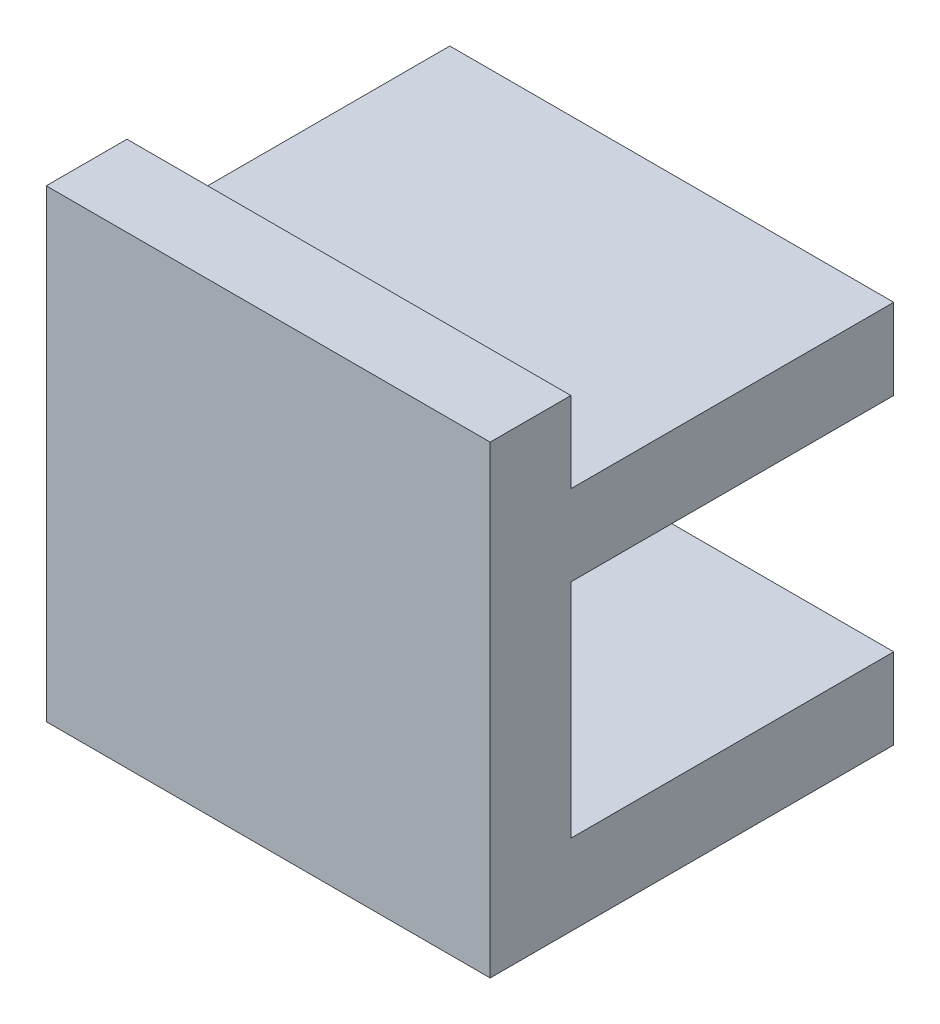
ISO-10303-21;
HEADER;
FILE_DESCRIPTION(('STEP AP214'),'2;1');
FILE_NAME('part.step','',(''),(''),'','','');
FILE_SCHEMA(('AUTOMOTIVE_DESIGN { 1 0 10303 214 1 1 1 1 }'));
ENDSEC;
DATA;
#1=APPLICATION_CONTEXT('core data for automotive mechanical design processes');
#2=APPLICATION_PROTOCOL_DEFINITION('international standard','automotive_design',2000,#1);
#3=PRODUCT_CONTEXT('',#1,'mechanical');
#4=PRODUCT('Part','Part','',(#3));
#5=PRODUCT_RELATED_PRODUCT_CATEGORY('part','',(#4));
#6=PRODUCT_DEFINITION_FORMATION('','',#4);
#7=PRODUCT_DEFINITION_CONTEXT('part definition',#1,'design');
#8=PRODUCT_DEFINITION('design','',#6,#7);
#9=PRODUCT_DEFINITION_SHAPE('','',#8);
#10=(LENGTH_UNIT() NAMED_UNIT(*) SI_UNIT(.MILLI.,.METRE.));
#11=(NAMED_UNIT(*) PLANE_ANGLE_UNIT() SI_UNIT($,.RADIAN.));
#12=(NAMED_UNIT(*) SI_UNIT($,.STERADIAN.) SOLID_ANGLE_UNIT());
#13=UNCERTAINTY_MEASURE_WITH_UNIT(LENGTH_MEASURE(1.E-05),#10,'distance_accuracy_value','');
#14=(GEOMETRIC_REPRESENTATION_CONTEXT(3) GLOBAL_UNCERTAINTY_ASSIGNED_CONTEXT((#13)) GLOBAL_UNIT_ASSIGNED_CONTEXT((#10,
#11,#12)) REPRESENTATION_CONTEXT('',''));
#15=CARTESIAN_POINT('',(0.,0.,0.));
#16=DIRECTION('',(0.,0.,1.));
#17=DIRECTION('',(1.,0.,0.));
#18=AXIS2_PLACEMENT_3D('',#15,#16,#17);
#19=CARTESIAN_POINT('',(55.,-57.5,0.));
#20=DIRECTION('',(0.,1.,0.));
#21=DIRECTION('',(0.,0.,1.));
#22=AXIS2_PLACEMENT_3D('',#19,#20,#21);
#23=PLANE('',#22);
#24=DIRECTION('',(0.,0.,-1.));
#25=VECTOR('',#24,1.);
#26=CARTESIAN_POINT('',(-55.,-57.5,0.));
#27=LINE('',#26,#25);
#28=CARTESIAN_POINT('',(-55.,-57.5,10.));
#29=VERTEX_POINT('',#28);
#30=CARTESIAN_POINT('',(-55.,-57.5,-90.));
#31=VERTEX_POINT('',#30);
#32=EDGE_CURVE('E148',#29,#31,#27,.T.);
#33=ORIENTED_EDGE('',*,*,#32,.T.);
#34=DIRECTION('',(-1.,0.,0.));
#35=VECTOR('',#34,1.);
#36=CARTESIAN_POINT('',(55.,-57.5,-90.));
#37=LINE('',#36,#35);
#38=CARTESIAN_POINT('',(55.,-57.5,-90.));
#39=VERTEX_POINT('',#38);
#40=EDGE_CURVE('E11',#39,#31,#37,.T.);
#41=ORIENTED_EDGE('',*,*,#40,.F.);
#42=DIRECTION('',(0.,0.,-1.));
#43=VECTOR('',#42,1.);
#44=CARTESIAN_POINT('',(55.,-57.5,0.));
#45=LINE('',#44,#43);
#46=CARTESIAN_POINT('',(55.,-57.5,10.));
#47=VERTEX_POINT('',#46);
#48=EDGE_CURVE('E170',#47,#39,#45,.T.);
#49=ORIENTED_EDGE('',*,*,#48,.F.);
#50=DIRECTION('',(-1.,0.,0.));
#51=VECTOR('',#50,1.);
#52=CARTESIAN_POINT('',(55.,-57.5,10.));
#53=LINE('',#52,#51);
#54=EDGE_CURVE('E53',#47,#29,#53,.T.);
#55=ORIENTED_EDGE('',*,*,#54,.T.);
#56=EDGE_LOOP('',(#33,#41,#49,#55));
#57=FACE_BOUND('',#56,.T.);
#58=ADVANCED_FACE('F37',(#57),#23,.F.);
#59=CARTESIAN_POINT('',(55.,0.,-90.));
#60=DIRECTION('',(0.,0.,1.));
#61=DIRECTION('',(1.,0.,0.));
#62=AXIS2_PLACEMENT_3D('',#59,#60,#61);
#63=PLANE('',#62);
#64=DIRECTION('',(0.,1.,0.));
#65=VECTOR('',#64,1.);
#66=CARTESIAN_POINT('',(-55.,0.,-90.));
#67=LINE('',#66,#65);
#68=CARTESIAN_POINT('',(-55.,-37.5,-90.));
#69=VERTEX_POINT('',#68);
#70=EDGE_CURVE('E150',#31,#69,#67,.T.);
#71=ORIENTED_EDGE('',*,*,#70,.T.);
#72=DIRECTION('',(-1.,0.,0.));
#73=VECTOR('',#72,1.);
#74=CARTESIAN_POINT('',(55.,-37.5,-90.));
#75=LINE('',#74,#73);
#76=CARTESIAN_POINT('',(55.,-37.5,-90.));
#77=VERTEX_POINT('',#76);
#78=EDGE_CURVE('E45',#77,#69,#75,.T.);
#79=ORIENTED_EDGE('',*,*,#78,.F.);
#80=DIRECTION('',(0.,1.,0.));
#81=VECTOR('',#80,1.);
#82=CARTESIAN_POINT('',(55.,0.,-90.));
#83=LINE('',#82,#81);
#84=EDGE_CURVE('E97',#39,#77,#83,.T.);
#85=ORIENTED_EDGE('',*,*,#84,.F.);
#86=ORIENTED_EDGE('',*,*,#40,.T.);
#87=EDGE_LOOP('',(#71,#79,#85,#86));
#88=FACE_BOUND('',#87,.T.);
#89=ADVANCED_FACE('F210',(#88),#63,.F.);
#90=CARTESIAN_POINT('',(55.,-37.5,0.));
#91=DIRECTION('',(0.,-1.,0.));
#92=DIRECTION('',(0.,0.,-1.));
#93=AXIS2_PLACEMENT_3D('',#90,#91,#92);
#94=PLANE('',#93);
#95=DIRECTION('',(0.,0.,1.));
#96=VECTOR('',#95,1.);
#97=CARTESIAN_POINT('',(-55.,-37.5,0.));
#98=LINE('',#97,#96);
#99=CARTESIAN_POINT('',(-55.,-37.5,-10.));
#100=VERTEX_POINT('',#99);
#101=EDGE_CURVE('E152',#69,#100,#98,.T.);
#102=ORIENTED_EDGE('',*,*,#101,.T.);
#103=DIRECTION('',(-1.,0.,0.));
#104=VECTOR('',#103,1.);
#105=CARTESIAN_POINT('',(55.,-37.5,-10.));
#106=LINE('',#105,#104);
#107=CARTESIAN_POINT('',(55.,-37.5,-10.));
#108=VERTEX_POINT('',#107);
#109=EDGE_CURVE('E181',#108,#100,#106,.T.);
#110=ORIENTED_EDGE('',*,*,#109,.F.);
#111=DIRECTION('',(0.,0.,1.));
#112=VECTOR('',#111,1.);
#113=CARTESIAN_POINT('',(55.,-37.5,0.));
#114=LINE('',#113,#112);
#115=EDGE_CURVE('E189',#77,#108,#114,.T.);
#116=ORIENTED_EDGE('',*,*,#115,.F.);
#117=ORIENTED_EDGE('',*,*,#78,.T.);
#118=EDGE_LOOP('',(#102,#110,#116,#117));
#119=FACE_BOUND('',#118,.T.);
#120=ADVANCED_FACE('F187',(#119),#94,.F.);
#121=CARTESIAN_POINT('',(55.,0.,-10.));
#122=DIRECTION('',(0.,0.,1.));
#123=DIRECTION('',(1.,0.,0.));
#124=AXIS2_PLACEMENT_3D('',#121,#122,#123);
#125=PLANE('',#124);
#126=DIRECTION('',(0.,1.,0.));
#127=VECTOR('',#126,1.);
#128=CARTESIAN_POINT('',(-55.,0.,-10.));
#129=LINE('',#128,#127);
#130=CARTESIAN_POINT('',(-55.,17.5,-10.));
#131=VERTEX_POINT('',#130);
#132=EDGE_CURVE('E154',#100,#131,#129,.T.);
#133=ORIENTED_EDGE('',*,*,#132,.T.);
#134=DIRECTION('',(-1.,0.,0.));
#135=VECTOR('',#134,1.);
#136=CARTESIAN_POINT('',(55.,17.5,-10.));
#137=LINE('',#136,#135);
#138=CARTESIAN_POINT('',(55.,17.5,-10.));
#139=VERTEX_POINT('',#138);
#140=EDGE_CURVE('E178',#139,#131,#137,.T.);
#141=ORIENTED_EDGE('',*,*,#140,.F.);
#142=DIRECTION('',(0.,1.,0.));
#143=VECTOR('',#142,1.);
#144=CARTESIAN_POINT('',(55.,0.,-10.));
#145=LINE('',#144,#143);
#146=EDGE_CURVE('E131',#108,#139,#145,.T.);
#147=ORIENTED_EDGE('',*,*,#146,.F.);
#148=ORIENTED_EDGE('',*,*,#109,.T.);
#149=EDGE_LOOP('',(#133,#141,#147,#148));
#150=FACE_BOUND('',#149,.T.);
#151=ADVANCED_FACE('F196',(#150),#125,.F.);
#152=CARTESIAN_POINT('',(55.,17.5,0.));
#153=DIRECTION('',(0.,1.,0.));
#154=DIRECTION('',(0.,0.,1.));
#155=AXIS2_PLACEMENT_3D('',#152,#153,#154);
#156=PLANE('',#155);
#157=DIRECTION('',(0.,0.,-1.));
#158=VECTOR('',#157,1.);
#159=CARTESIAN_POINT('',(-55.,17.5,0.));
#160=LINE('',#159,#158);
#161=CARTESIAN_POINT('',(-55.,17.5,-90.));
#162=VERTEX_POINT('',#161);
#163=EDGE_CURVE('E156',#131,#162,#160,.T.);
#164=ORIENTED_EDGE('',*,*,#163,.T.);
#165=DIRECTION('',(-1.,0.,0.));
#166=VECTOR('',#165,1.);
#167=CARTESIAN_POINT('',(55.,17.5,-90.));
#168=LINE('',#167,#166);
#169=CARTESIAN_POINT('',(55.,17.5,-90.));
#170=VERTEX_POINT('',#169);
#171=EDGE_CURVE('E176',#170,#162,#168,.T.);
#172=ORIENTED_EDGE('',*,*,#171,.F.);
#173=DIRECTION('',(0.,0.,-1.));
#174=VECTOR('',#173,1.);
#175=CARTESIAN_POINT('',(55.,17.5,0.));
#176=LINE('',#175,#174);
#177=EDGE_CURVE('E202',#139,#170,#176,.T.);
#178=ORIENTED_EDGE('',*,*,#177,.F.);
#179=ORIENTED_EDGE('',*,*,#140,.T.);
#180=EDGE_LOOP('',(#164,#172,#178,#179));
#181=FACE_BOUND('',#180,.T.);
#182=ADVANCED_FACE('F200',(#181),#156,.F.);
#183=CARTESIAN_POINT('',(55.,0.,-90.));
#184=DIRECTION('',(0.,0.,-1.));
#185=DIRECTION('',(-1.,0.,0.));
#186=AXIS2_PLACEMENT_3D('',#183,#184,#185);
#187=PLANE('',#186);
#188=DIRECTION('',(0.,-1.,0.));
#189=VECTOR('',#188,1.);
#190=CARTESIAN_POINT('',(-55.,0.,-90.));
#191=LINE('',#190,#189);
#192=CARTESIAN_POINT('',(-55.,37.5,-90.));
#193=VERTEX_POINT('',#192);
#194=EDGE_CURVE('E159',#193,#162,#191,.T.);
#195=ORIENTED_EDGE('',*,*,#194,.F.);
#196=DIRECTION('',(-1.,0.,0.));
#197=VECTOR('',#196,1.);
#198=CARTESIAN_POINT('',(55.,37.5,-90.));
#199=LINE('',#198,#197);
#200=CARTESIAN_POINT('',(55.,37.5,-90.));
#201=VERTEX_POINT('',#200);
#202=EDGE_CURVE('E174',#201,#193,#199,.T.);
#203=ORIENTED_EDGE('',*,*,#202,.F.);
#204=DIRECTION('',(0.,-1.,0.));
#205=VECTOR('',#204,1.);
#206=CARTESIAN_POINT('',(55.,0.,-90.));
#207=LINE('',#206,#205);
#208=EDGE_CURVE('E204',#201,#170,#207,.T.);
#209=ORIENTED_EDGE('',*,*,#208,.T.);
#210=ORIENTED_EDGE('',*,*,#171,.T.);
#211=EDGE_LOOP('',(#195,#203,#209,#210));
#212=FACE_BOUND('',#211,.T.);
#213=ADVANCED_FACE('F220',(#212),#187,.T.);
#214=CARTESIAN_POINT('',(55.,37.5,0.));
#215=DIRECTION('',(0.,1.,0.));
#216=DIRECTION('',(0.,0.,1.));
#217=AXIS2_PLACEMENT_3D('',#214,#215,#216);
#218=PLANE('',#217);
#219=DIRECTION('',(0.,0.,-1.));
#220=VECTOR('',#219,1.);
#221=CARTESIAN_POINT('',(-55.,37.5,0.));
#222=LINE('',#221,#220);
#223=CARTESIAN_POINT('',(-55.,37.5,-10.));
#224=VERTEX_POINT('',#223);
#225=EDGE_CURVE('E162',#224,#193,#222,.T.);
#226=ORIENTED_EDGE('',*,*,#225,.F.);
#227=DIRECTION('',(-1.,0.,0.));
#228=VECTOR('',#227,1.);
#229=CARTESIAN_POINT('',(55.,37.5,-10.));
#230=LINE('',#229,#228);
#231=CARTESIAN_POINT('',(55.,37.5,-10.));
#232=VERTEX_POINT('',#231);
#233=EDGE_CURVE('E139',#232,#224,#230,.T.);
#234=ORIENTED_EDGE('',*,*,#233,.F.);
#235=DIRECTION('',(0.,0.,-1.));
#236=VECTOR('',#235,1.);
#237=CARTESIAN_POINT('',(55.,37.5,0.));
#238=LINE('',#237,#236);
#239=EDGE_CURVE('E128',#232,#201,#238,.T.);
#240=ORIENTED_EDGE('',*,*,#239,.T.);
#241=ORIENTED_EDGE('',*,*,#202,.T.);
#242=EDGE_LOOP('',(#226,#234,#240,#241));
#243=FACE_BOUND('',#242,.T.);
#244=ADVANCED_FACE('F223',(#243),#218,.T.);
#245=CARTESIAN_POINT('',(-55.,57.5,-10.));
#246=VERTEX_POINT('',#245);
#247=EDGE_CURVE('E136',#224,#246,#129,.T.);
#248=ORIENTED_EDGE('',*,*,#247,.T.);
#249=DIRECTION('',(-1.,0.,0.));
#250=VECTOR('',#249,1.);
#251=CARTESIAN_POINT('',(55.,57.5,-10.));
#252=LINE('',#251,#250);
#253=CARTESIAN_POINT('',(55.,57.5,-10.));
#254=VERTEX_POINT('',#253);
#255=EDGE_CURVE('E133',#254,#246,#252,.T.);
#256=ORIENTED_EDGE('',*,*,#255,.F.);
#257=EDGE_CURVE('E120',#232,#254,#145,.T.);
#258=ORIENTED_EDGE('',*,*,#257,.F.);
#259=ORIENTED_EDGE('',*,*,#233,.T.);
#260=EDGE_LOOP('',(#248,#256,#258,#259));
#261=FACE_BOUND('',#260,.T.);
#262=ADVANCED_FACE('F134',(#261),#125,.F.);
#263=CARTESIAN_POINT('',(55.,57.5,0.));
#264=DIRECTION('',(0.,1.,0.));
#265=DIRECTION('',(0.,0.,1.));
#266=AXIS2_PLACEMENT_3D('',#263,#264,#265);
#267=PLANE('',#266);
#268=DIRECTION('',(0.,0.,-1.));
#269=VECTOR('',#268,1.);
#270=CARTESIAN_POINT('',(-55.,57.5,0.));
#271=LINE('',#270,#269);
#272=CARTESIAN_POINT('',(-55.,57.5,10.));
#273=VERTEX_POINT('',#272);
#274=EDGE_CURVE('E165',#273,#246,#271,.T.);
#275=ORIENTED_EDGE('',*,*,#274,.F.);
#276=DIRECTION('',(-1.,0.,0.));
#277=VECTOR('',#276,1.);
#278=CARTESIAN_POINT('',(55.,57.5,10.));
#279=LINE('',#278,#277);
#280=CARTESIAN_POINT('',(55.,57.5,10.));
#281=VERTEX_POINT('',#280);
#282=EDGE_CURVE('E85',#281,#273,#279,.T.);
#283=ORIENTED_EDGE('',*,*,#282,.F.);
#284=DIRECTION('',(0.,0.,-1.));
#285=VECTOR('',#284,1.);
#286=CARTESIAN_POINT('',(55.,57.5,0.));
#287=LINE('',#286,#285);
#288=EDGE_CURVE('E125',#281,#254,#287,.T.);
#289=ORIENTED_EDGE('',*,*,#288,.T.);
#290=ORIENTED_EDGE('',*,*,#255,.T.);
#291=EDGE_LOOP('',(#275,#283,#289,#290));
#292=FACE_BOUND('',#291,.T.);
#293=ADVANCED_FACE('F141',(#292),#267,.T.);
#294=CARTESIAN_POINT('',(55.,0.,10.));
#295=DIRECTION('',(0.,0.,1.));
#296=DIRECTION('',(1.,0.,0.));
#297=AXIS2_PLACEMENT_3D('',#294,#295,#296);
#298=PLANE('',#297);
#299=DIRECTION('',(0.,1.,0.));
#300=VECTOR('',#299,1.);
#301=CARTESIAN_POINT('',(-55.,0.,10.));
#302=LINE('',#301,#300);
#303=EDGE_CURVE('E167',#29,#273,#302,.T.);
#304=ORIENTED_EDGE('',*,*,#303,.F.);
#305=ORIENTED_EDGE('',*,*,#54,.F.);
#306=DIRECTION('',(0.,1.,0.));
#307=VECTOR('',#306,1.);
#308=CARTESIAN_POINT('',(55.,0.,10.));
#309=LINE('',#308,#307);
#310=EDGE_CURVE('E142',#47,#281,#309,.T.);
#311=ORIENTED_EDGE('',*,*,#310,.T.);
#312=ORIENTED_EDGE('',*,*,#282,.T.);
#313=EDGE_LOOP('',(#304,#305,#311,#312));
#314=FACE_BOUND('',#313,.T.);
#315=ADVANCED_FACE('F232',(#314),#298,.T.);
#316=CARTESIAN_POINT('',(55.,0.,0.));
#317=DIRECTION('',(1.,0.,0.));
#318=DIRECTION('',(0.,0.,-1.));
#319=AXIS2_PLACEMENT_3D('',#316,#317,#318);
#320=PLANE('',#319);
#321=ORIENTED_EDGE('',*,*,#48,.T.);
#322=ORIENTED_EDGE('',*,*,#84,.T.);
#323=ORIENTED_EDGE('',*,*,#115,.T.);
#324=ORIENTED_EDGE('',*,*,#146,.T.);
#325=ORIENTED_EDGE('',*,*,#177,.T.);
#326=ORIENTED_EDGE('',*,*,#208,.F.);
#327=ORIENTED_EDGE('',*,*,#239,.F.);
#328=ORIENTED_EDGE('',*,*,#257,.T.);
#329=ORIENTED_EDGE('',*,*,#288,.F.);
#330=ORIENTED_EDGE('',*,*,#310,.F.);
#331=EDGE_LOOP('',(#321,#322,#323,#324,#325,#326,#327,#328,#329,#330));
#332=FACE_BOUND('',#331,.T.);
#333=ADVANCED_FACE('F122',(#332),#320,.T.);
#334=CARTESIAN_POINT('',(-55.,0.,0.));
#335=DIRECTION('',(1.,0.,0.));
#336=DIRECTION('',(0.,0.,-1.));
#337=AXIS2_PLACEMENT_3D('',#334,#335,#336);
#338=PLANE('',#337);
#339=ORIENTED_EDGE('',*,*,#32,.F.);
#340=ORIENTED_EDGE('',*,*,#303,.T.);
#341=ORIENTED_EDGE('',*,*,#274,.T.);
#342=ORIENTED_EDGE('',*,*,#247,.F.);
#343=ORIENTED_EDGE('',*,*,#225,.T.);
#344=ORIENTED_EDGE('',*,*,#194,.T.);
#345=ORIENTED_EDGE('',*,*,#163,.F.);
#346=ORIENTED_EDGE('',*,*,#132,.F.);
#347=ORIENTED_EDGE('',*,*,#101,.F.);
#348=ORIENTED_EDGE('',*,*,#70,.F.);
#349=EDGE_LOOP('',(#339,#340,#341,#342,#343,#344,#345,#346,#347,#348));
#350=FACE_BOUND('',#349,.T.);
#351=ADVANCED_FACE('F192',(#350),#338,.F.);
#352=CLOSED_SHELL('',(#58,#89,#120,#151,#182,#213,#244,#262,#293,#315,#333,#351));
#353=MANIFOLD_SOLID_BREP('B2',#352);
#354=ADVANCED_BREP_SHAPE_REPRESENTATION('',(#18,#353),#14);
#355=SHAPE_DEFINITION_REPRESENTATION(#9,#354);
ENDSEC;
END-ISO-10303-21;
